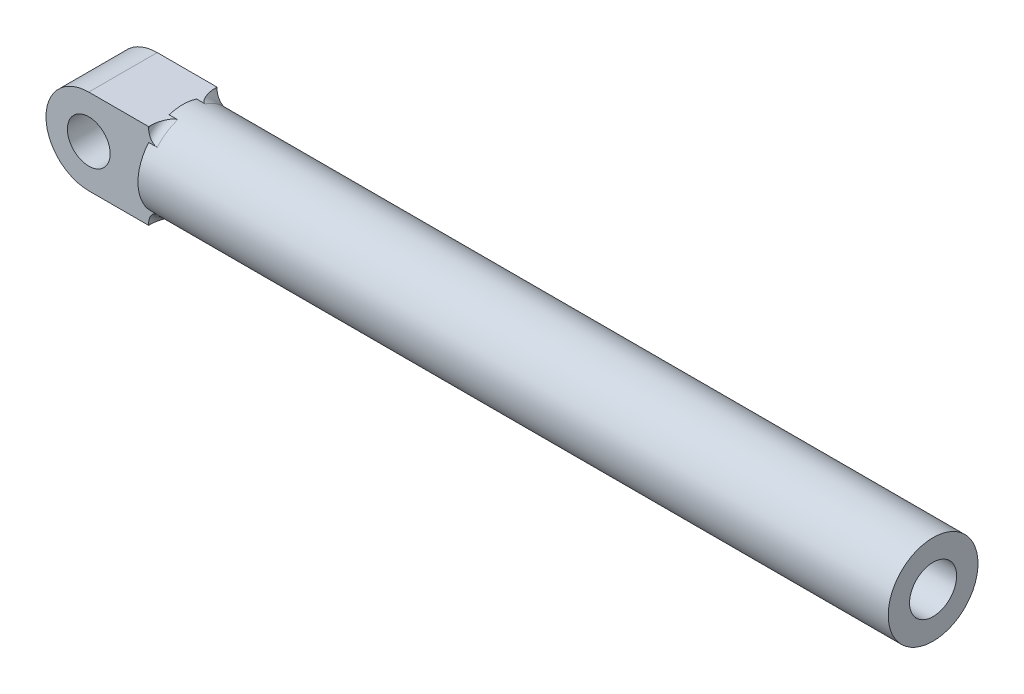
ISO-10303-21;
HEADER;
FILE_DESCRIPTION(('STEP AP214'),'2;1');
FILE_NAME('part.step','',(''),(''),'','','');
FILE_SCHEMA(('AUTOMOTIVE_DESIGN { 1 0 10303 214 1 1 1 1 }'));
ENDSEC;
DATA;
#1=APPLICATION_CONTEXT('core data for automotive mechanical design processes');
#2=APPLICATION_PROTOCOL_DEFINITION('international standard','automotive_design',2000,#1);
#3=PRODUCT_CONTEXT('',#1,'mechanical');
#4=PRODUCT('Part','Part','',(#3));
#5=PRODUCT_RELATED_PRODUCT_CATEGORY('part','',(#4));
#6=PRODUCT_DEFINITION_FORMATION('','',#4);
#7=PRODUCT_DEFINITION_CONTEXT('part definition',#1,'design');
#8=PRODUCT_DEFINITION('design','',#6,#7);
#9=PRODUCT_DEFINITION_SHAPE('','',#8);
#10=(LENGTH_UNIT() NAMED_UNIT(*) SI_UNIT(.MILLI.,.METRE.));
#11=(NAMED_UNIT(*) PLANE_ANGLE_UNIT() SI_UNIT($,.RADIAN.));
#12=(NAMED_UNIT(*) SI_UNIT($,.STERADIAN.) SOLID_ANGLE_UNIT());
#13=UNCERTAINTY_MEASURE_WITH_UNIT(LENGTH_MEASURE(1.E-05),#10,'distance_accuracy_value','');
#14=(GEOMETRIC_REPRESENTATION_CONTEXT(3) GLOBAL_UNCERTAINTY_ASSIGNED_CONTEXT((#13)) GLOBAL_UNIT_ASSIGNED_CONTEXT((#10,
#11,#12)) REPRESENTATION_CONTEXT('',''));
#15=CARTESIAN_POINT('',(0.,0.,0.));
#16=DIRECTION('',(0.,0.,1.));
#17=DIRECTION('',(1.,0.,0.));
#18=AXIS2_PLACEMENT_3D('',#15,#16,#17);
#19=CARTESIAN_POINT('',(-87.,0.,-52.5));
#20=DIRECTION('',(0.,0.,1.));
#21=DIRECTION('',(1.,0.,0.));
#22=AXIS2_PLACEMENT_3D('',#19,#20,#21);
#23=CYLINDRICAL_SURFACE('',#22,25.);
#24=CARTESIAN_POINT('',(-87.,0.,-40.));
#25=DIRECTION('',(0.,0.,1.));
#26=DIRECTION('',(1.,0.,0.));
#27=AXIS2_PLACEMENT_3D('',#24,#25,#26);
#28=CIRCLE('',#27,25.);
#29=CARTESIAN_POINT('',(-112.,0.,-40.));
#30=VERTEX_POINT('',#29);
#31=EDGE_CURVE('E25',#30,#30,#28,.T.);
#32=ORIENTED_EDGE('',*,*,#31,.F.);
#33=DIRECTION('',(0.,0.,1.));
#34=VECTOR('',#33,1.);
#35=CARTESIAN_POINT('',(-112.,0.,-52.5));
#36=LINE('',#35,#34);
#37=CARTESIAN_POINT('',(-112.,0.,40.));
#38=VERTEX_POINT('',#37);
#39=EDGE_CURVE('E11',#30,#38,#36,.T.);
#40=ORIENTED_EDGE('',*,*,#39,.T.);
#41=CARTESIAN_POINT('',(-87.,0.,40.));
#42=DIRECTION('',(0.,0.,1.));
#43=DIRECTION('',(1.,0.,0.));
#44=AXIS2_PLACEMENT_3D('',#41,#42,#43);
#45=CIRCLE('',#44,25.);
#46=EDGE_CURVE('E303',#38,#38,#45,.T.);
#47=ORIENTED_EDGE('',*,*,#46,.T.);
#48=ORIENTED_EDGE('',*,*,#39,.F.);
#49=EDGE_LOOP('',(#32,#40,#47,#48));
#50=FACE_BOUND('',#49,.T.);
#51=ADVANCED_FACE('F16',(#50),#23,.F.);
#52=CARTESIAN_POINT('',(-6.99999999999991,0.,0.));
#53=DIRECTION('',(-1.,0.,0.));
#54=DIRECTION('',(0.,0.,1.));
#55=AXIS2_PLACEMENT_3D('',#52,#53,#54);
#56=TOROIDAL_SURFACE('',#55,62.5,10.);
#57=CARTESIAN_POINT('',(-6.99999999999999,50.,-16.0078105935821));
#58=CARTESIAN_POINT('',(-8.3757529835826,50.,-16.0078105935821));
#59=CARTESIAN_POINT('',(-9.79273473438209,50.,-17.2679061705847));
#60=CARTESIAN_POINT('',(-10.811375688457,50.,-18.1737646688041));
#61=CARTESIAN_POINT('',(-11.8159590088257,50.,-19.6829022776896));
#62=CARTESIAN_POINT('',(-13.3583163061764,50.,-21.9999120832245));
#63=CARTESIAN_POINT('',(-14.5900398892349,50.,-25.1904163602448));
#64=CARTESIAN_POINT('',(-15.7495333176843,50.,-28.1938245871611));
#65=CARTESIAN_POINT('',(-16.3681689028075,50.,-31.3302734693486));
#66=CARTESIAN_POINT('',(-17.,50.,-34.5336228824376));
#67=CARTESIAN_POINT('',(-17.,50.,-37.5));
#68=B_SPLINE_CURVE_WITH_KNOTS('',2,(#57,#58,#59,#60,#61,#62,#63,#64,#65,#66,#67),.UNSPECIFIED.,
.F.,.F.,(3,2,2,2,2,3),(0.,0.125,0.25,0.5,0.75,1.),.UNSPECIFIED.);
#69=CARTESIAN_POINT('',(-6.99999999999991,50.,-16.0078105935821));
#70=VERTEX_POINT('',#69);
#71=CARTESIAN_POINT('',(-17.,50.,-37.5));
#72=VERTEX_POINT('',#71);
#73=EDGE_CURVE('E423',#70,#72,#68,.T.);
#74=ORIENTED_EDGE('',*,*,#73,.F.);
#75=CARTESIAN_POINT('',(-6.99999999999991,0.,0.));
#76=DIRECTION('',(1.,0.,0.));
#77=DIRECTION('',(0.,0.,1.));
#78=AXIS2_PLACEMENT_3D('',#75,#76,#77);
#79=CIRCLE('',#78,52.5);
#80=CARTESIAN_POINT('',(-6.99999999999991,34.0036762718386,-40.));
#81=VERTEX_POINT('',#80);
#82=EDGE_CURVE('E206',#81,#70,#79,.T.);
#83=ORIENTED_EDGE('',*,*,#82,.F.);
#84=CARTESIAN_POINT('',(-17.,48.0234317807464,-40.));
#85=CARTESIAN_POINT('',(-17.,45.6565577303607,-40.));
#86=CARTESIAN_POINT('',(-16.3536993868603,43.3229169140239,-40.));
#87=CARTESIAN_POINT('',(-16.0450929589387,42.2086110604629,-40.));
#88=CARTESIAN_POINT('',(-15.5934174876705,41.1495749788464,-40.));
#89=CARTESIAN_POINT('',(-15.1082020351406,40.0118982523589,-40.));
#90=CARTESIAN_POINT('',(-14.4840350448594,39.0038193226509,-40.));
#91=CARTESIAN_POINT('',(-13.8505404749445,37.9806756159836,-40.));
#92=CARTESIAN_POINT('',(-13.1137885685689,37.144986664751,-40.));
#93=CARTESIAN_POINT('',(-12.2786054061227,36.1976483069239,-40.));
#94=CARTESIAN_POINT('',(-11.3488315247879,35.5219521323174,-40.));
#95=CARTESIAN_POINT('',(-10.3639886854479,34.8062355989865,-40.));
#96=CARTESIAN_POINT('',(-9.31588381237329,34.4225979387912,-40.));
#97=CARTESIAN_POINT('',(-8.17138240876739,34.0036762718386,-40.));
#98=CARTESIAN_POINT('',(-6.99999999999999,34.0036762718386,-40.));
#99=B_SPLINE_CURVE_WITH_KNOTS('',2,(#84,#85,#86,#87,#88,#89,#90,#91,#92,#93,#94,#95,#96,#97,
#98),.UNSPECIFIED.,.F.,.F.,(3,2,2,2,2,2,2,3),(0.,0.25,0.375,0.5,0.625,0.75,0.875,1.),.UNSPECIFIED.);
#100=CARTESIAN_POINT('',(-17.,48.0234317807464,-40.));
#101=VERTEX_POINT('',#100);
#102=EDGE_CURVE('E308',#101,#81,#99,.T.);
#103=ORIENTED_EDGE('',*,*,#102,.F.);
#104=CARTESIAN_POINT('',(-17.,0.,0.));
#105=DIRECTION('',(-1.,0.,0.));
#106=DIRECTION('',(0.,0.,1.));
#107=AXIS2_PLACEMENT_3D('',#104,#105,#106);
#108=CIRCLE('',#107,62.5);
#109=EDGE_CURVE('E386',#72,#101,#108,.T.);
#110=ORIENTED_EDGE('',*,*,#109,.F.);
#111=EDGE_LOOP('',(#74,#83,#103,#110));
#112=FACE_BOUND('',#111,.T.);
#113=ADVANCED_FACE('F357',(#112),#56,.F.);
#114=CARTESIAN_POINT('',(-6.99999999999991,0.,0.));
#115=DIRECTION('',(-1.,0.,0.));
#116=DIRECTION('',(0.,0.,1.));
#117=AXIS2_PLACEMENT_3D('',#114,#115,#116);
#118=TOROIDAL_SURFACE('',#117,62.5,10.);
#119=CARTESIAN_POINT('',(-6.99999999999999,34.0036762718386,40.));
#120=CARTESIAN_POINT('',(-8.17080767103919,34.0036762718386,40.));
#121=CARTESIAN_POINT('',(-9.31588381237329,34.4225979387912,40.));
#122=CARTESIAN_POINT('',(-10.362940285267,34.8056594900581,40.));
#123=CARTESIAN_POINT('',(-11.3488315247879,35.5219521323174,40.));
#124=CARTESIAN_POINT('',(-12.2777347853929,36.1968405421844,40.));
#125=CARTESIAN_POINT('',(-13.1137885685689,37.144986664751,40.));
#126=CARTESIAN_POINT('',(-13.8498348581443,37.9797169770035,40.));
#127=CARTESIAN_POINT('',(-14.4840350448594,39.0038193226509,40.));
#128=CARTESIAN_POINT('',(-15.1076556260574,40.0108377899692,40.));
#129=CARTESIAN_POINT('',(-15.5934174876705,41.1495749788464,40.));
#130=CARTESIAN_POINT('',(-16.0447055938528,42.2074977801572,40.));
#131=CARTESIAN_POINT('',(-16.3536993868603,43.3229169140239,40.));
#132=CARTESIAN_POINT('',(-17.,45.6559607694015,40.));
#133=CARTESIAN_POINT('',(-17.,48.0234317807464,40.));
#134=B_SPLINE_CURVE_WITH_KNOTS('',2,(#119,#120,#121,#122,#123,#124,#125,#126,#127,#128,#129,
#130,#131,#132,#133),.UNSPECIFIED.,.F.,.F.,(3,2,2,2,2,2,2,3),(0.,0.125,0.25,0.375,0.5,0.625,
0.75,1.),.UNSPECIFIED.);
#135=CARTESIAN_POINT('',(-6.99999999999991,34.0036762718386,40.));
#136=VERTEX_POINT('',#135);
#137=CARTESIAN_POINT('',(-17.,48.0234317807464,40.));
#138=VERTEX_POINT('',#137);
#139=EDGE_CURVE('E307',#136,#138,#134,.T.);
#140=ORIENTED_EDGE('',*,*,#139,.F.);
#141=CARTESIAN_POINT('',(-6.99999999999991,0.,0.));
#142=DIRECTION('',(1.,0.,0.));
#143=DIRECTION('',(0.,0.,1.));
#144=AXIS2_PLACEMENT_3D('',#141,#142,#143);
#145=CIRCLE('',#144,52.5);
#146=CARTESIAN_POINT('',(-6.99999999999991,50.,16.0078105935821));
#147=VERTEX_POINT('',#146);
#148=EDGE_CURVE('E518',#147,#136,#145,.T.);
#149=ORIENTED_EDGE('',*,*,#148,.F.);
#150=CARTESIAN_POINT('',(-17.,50.,37.5));
#151=CARTESIAN_POINT('',(-17.,50.,34.5342056868546));
#152=CARTESIAN_POINT('',(-16.3681689028075,50.,31.3302734693485));
#153=CARTESIAN_POINT('',(-15.7498859580405,50.,28.1950421471237));
#154=CARTESIAN_POINT('',(-14.5900398892349,50.,25.1904163602448));
#155=CARTESIAN_POINT('',(-13.3589171741833,50.,22.0011456837783));
#156=CARTESIAN_POINT('',(-11.8159590088257,50.,19.6829022776896));
#157=CARTESIAN_POINT('',(-10.8121554556432,50.,18.1747207725648));
#158=CARTESIAN_POINT('',(-9.79273473438209,50.,17.2679061705848));
#159=CARTESIAN_POINT('',(-8.37616343175739,50.,16.0078105935821));
#160=CARTESIAN_POINT('',(-6.99999999999999,50.,16.0078105935821));
#161=B_SPLINE_CURVE_WITH_KNOTS('',2,(#150,#151,#152,#153,#154,#155,#156,#157,#158,#159,#160),
.UNSPECIFIED.,.F.,.F.,(3,2,2,2,2,3),(0.,0.25,0.5,0.75,0.875,1.),.UNSPECIFIED.);
#162=CARTESIAN_POINT('',(-17.,50.,37.5));
#163=VERTEX_POINT('',#162);
#164=EDGE_CURVE('E305',#163,#147,#161,.T.);
#165=ORIENTED_EDGE('',*,*,#164,.F.);
#166=CARTESIAN_POINT('',(-17.,0.,0.));
#167=DIRECTION('',(-1.,0.,0.));
#168=DIRECTION('',(0.,0.,1.));
#169=AXIS2_PLACEMENT_3D('',#166,#167,#168);
#170=CIRCLE('',#169,62.5);
#171=EDGE_CURVE('E523',#138,#163,#170,.T.);
#172=ORIENTED_EDGE('',*,*,#171,.F.);
#173=EDGE_LOOP('',(#140,#149,#165,#172));
#174=FACE_BOUND('',#173,.T.);
#175=ADVANCED_FACE('F366',(#174),#118,.F.);
#176=CARTESIAN_POINT('',(-6.99999999999991,0.,0.));
#177=DIRECTION('',(-1.,0.,0.));
#178=DIRECTION('',(0.,0.,1.));
#179=AXIS2_PLACEMENT_3D('',#176,#177,#178);
#180=TOROIDAL_SURFACE('',#179,62.5,10.);
#181=CARTESIAN_POINT('',(-6.99999999999999,-50.,16.0078105935821));
#182=CARTESIAN_POINT('',(-8.375752983589,-50.,16.0078105935821));
#183=CARTESIAN_POINT('',(-9.79273473438209,-50.,17.2679061705848));
#184=CARTESIAN_POINT('',(-10.8113756884637,-50.,18.1737646688142));
#185=CARTESIAN_POINT('',(-11.8159590088257,-50.,19.6829022776896));
#186=CARTESIAN_POINT('',(-13.3583163061584,-50.,21.9999120831974));
#187=CARTESIAN_POINT('',(-14.5900398892349,-50.,25.1904163602448));
#188=CARTESIAN_POINT('',(-15.7495333176768,-50.,28.1938245871232));
#189=CARTESIAN_POINT('',(-16.3681689028075,-50.,31.3302734693485));
#190=CARTESIAN_POINT('',(-17.,-50.,34.5336228824376));
#191=CARTESIAN_POINT('',(-17.,-50.,37.5));
#192=B_SPLINE_CURVE_WITH_KNOTS('',2,(#181,#182,#183,#184,#185,#186,#187,#188,#189,#190,#191),
.UNSPECIFIED.,.F.,.F.,(3,2,2,2,2,3),(0.,0.125,0.25,0.5,0.75,1.),.UNSPECIFIED.);
#193=CARTESIAN_POINT('',(-6.99999999999991,-50.,16.0078105935821));
#194=VERTEX_POINT('',#193);
#195=CARTESIAN_POINT('',(-17.,-50.,37.5));
#196=VERTEX_POINT('',#195);
#197=EDGE_CURVE('E300',#194,#196,#192,.T.);
#198=ORIENTED_EDGE('',*,*,#197,.F.);
#199=CARTESIAN_POINT('',(-6.99999999999991,0.,0.));
#200=DIRECTION('',(1.,0.,0.));
#201=DIRECTION('',(0.,0.,1.));
#202=AXIS2_PLACEMENT_3D('',#199,#200,#201);
#203=CIRCLE('',#202,52.5);
#204=CARTESIAN_POINT('',(-6.99999999999991,-34.0036762718386,40.));
#205=VERTEX_POINT('',#204);
#206=EDGE_CURVE('E430',#205,#194,#203,.T.);
#207=ORIENTED_EDGE('',*,*,#206,.F.);
#208=CARTESIAN_POINT('',(-17.,-48.0234317807464,40.));
#209=CARTESIAN_POINT('',(-17.,-45.6565577304488,40.));
#210=CARTESIAN_POINT('',(-16.3536993868603,-43.3229169140239,40.));
#211=CARTESIAN_POINT('',(-16.0450929589911,-42.2086110606102,40.));
#212=CARTESIAN_POINT('',(-15.5934174876705,-41.1495749788463,40.));
#213=CARTESIAN_POINT('',(-15.1082020351466,-40.0118982523466,40.));
#214=CARTESIAN_POINT('',(-14.4840350448594,-39.0038193226509,40.));
#215=CARTESIAN_POINT('',(-13.8505404748983,-37.9806756159312,40.));
#216=CARTESIAN_POINT('',(-13.1137885685689,-37.1449866647509,40.));
#217=CARTESIAN_POINT('',(-12.2786054061065,-36.1976483069055,40.));
#218=CARTESIAN_POINT('',(-11.3488315247879,-35.5219521323174,40.));
#219=CARTESIAN_POINT('',(-10.3639886854285,-34.8062355989794,40.));
#220=CARTESIAN_POINT('',(-9.31588381237329,-34.4225979387912,40.));
#221=CARTESIAN_POINT('',(-8.17138240876739,-34.0036762718386,40.));
#222=CARTESIAN_POINT('',(-6.99999999999999,-34.0036762718386,40.));
#223=B_SPLINE_CURVE_WITH_KNOTS('',2,(#208,#209,#210,#211,#212,#213,#214,#215,#216,#217,#218,
#219,#220,#221,#222),.UNSPECIFIED.,.F.,.F.,(3,2,2,2,2,2,2,3),(0.,0.25,0.375,0.5,0.625,0.75,
0.875,1.),.UNSPECIFIED.);
#224=CARTESIAN_POINT('',(-17.,-48.0234317807464,40.));
#225=VERTEX_POINT('',#224);
#226=EDGE_CURVE('E551',#225,#205,#223,.T.);
#227=ORIENTED_EDGE('',*,*,#226,.F.);
#228=CARTESIAN_POINT('',(-17.,0.,0.));
#229=DIRECTION('',(-1.,0.,0.));
#230=DIRECTION('',(0.,0.,1.));
#231=AXIS2_PLACEMENT_3D('',#228,#229,#230);
#232=CIRCLE('',#231,62.5);
#233=EDGE_CURVE('E436',#196,#225,#232,.T.);
#234=ORIENTED_EDGE('',*,*,#233,.F.);
#235=EDGE_LOOP('',(#198,#207,#227,#234));
#236=FACE_BOUND('',#235,.T.);
#237=ADVANCED_FACE('F450',(#236),#180,.F.);
#238=CARTESIAN_POINT('',(-6.99999999999991,0.,0.));
#239=DIRECTION('',(-1.,0.,0.));
#240=DIRECTION('',(0.,0.,1.));
#241=AXIS2_PLACEMENT_3D('',#238,#239,#240);
#242=TOROIDAL_SURFACE('',#241,62.5,10.);
#243=CARTESIAN_POINT('',(-6.99999999999999,-34.0036762718386,-40.));
#244=CARTESIAN_POINT('',(-8.17080767109089,-34.0036762718386,-40.));
#245=CARTESIAN_POINT('',(-9.31588381237329,-34.4225979387912,-40.));
#246=CARTESIAN_POINT('',(-10.362940285315,-34.805659490093,-40.));
#247=CARTESIAN_POINT('',(-11.3488315247879,-35.5219521323174,-40.));
#248=CARTESIAN_POINT('',(-12.2777347853929,-36.1968405421844,-40.));
#249=CARTESIAN_POINT('',(-13.1137885685689,-37.1449866647509,-40.));
#250=CARTESIAN_POINT('',(-13.8498348581585,-37.9797169770196,-40.));
#251=CARTESIAN_POINT('',(-14.4840350448594,-39.0038193226509,-40.));
#252=CARTESIAN_POINT('',(-15.1076556260116,-40.010837789902,-40.));
#253=CARTESIAN_POINT('',(-15.5934174876705,-41.1495749788463,-40.));
#254=CARTESIAN_POINT('',(-16.0447055937903,-42.2074977799733,-40.));
#255=CARTESIAN_POINT('',(-16.3536993868603,-43.3229169140239,-40.));
#256=CARTESIAN_POINT('',(-17.,-45.6559607693141,-40.));
#257=CARTESIAN_POINT('',(-17.,-48.0234317807464,-40.));
#258=B_SPLINE_CURVE_WITH_KNOTS('',2,(#243,#244,#245,#246,#247,#248,#249,#250,#251,#252,#253,
#254,#255,#256,#257),.UNSPECIFIED.,.F.,.F.,(3,2,2,2,2,2,2,3),(0.,0.125,0.25,0.375,0.5,0.625,
0.75,1.),.UNSPECIFIED.);
#259=CARTESIAN_POINT('',(-6.99999999999991,-34.0036762718386,-40.));
#260=VERTEX_POINT('',#259);
#261=CARTESIAN_POINT('',(-17.,-48.0234317807464,-40.));
#262=VERTEX_POINT('',#261);
#263=EDGE_CURVE('E310',#260,#262,#258,.T.);
#264=ORIENTED_EDGE('',*,*,#263,.F.);
#265=CARTESIAN_POINT('',(-6.99999999999991,0.,0.));
#266=DIRECTION('',(1.,0.,0.));
#267=DIRECTION('',(0.,0.,1.));
#268=AXIS2_PLACEMENT_3D('',#265,#266,#267);
#269=CIRCLE('',#268,52.5);
#270=CARTESIAN_POINT('',(-6.99999999999991,-50.,-16.0078105935821));
#271=VERTEX_POINT('',#270);
#272=EDGE_CURVE('E592',#271,#260,#269,.T.);
#273=ORIENTED_EDGE('',*,*,#272,.F.);
#274=CARTESIAN_POINT('',(-17.,-50.,-37.5));
#275=CARTESIAN_POINT('',(-17.,-50.,-34.5342056868546));
#276=CARTESIAN_POINT('',(-16.3681689028075,-50.,-31.3302734693486));
#277=CARTESIAN_POINT('',(-15.7498859580405,-50.,-28.1950421471237));
#278=CARTESIAN_POINT('',(-14.5900398892349,-50.,-25.1904163602448));
#279=CARTESIAN_POINT('',(-13.3589171741761,-50.,-22.0011456837598));
#280=CARTESIAN_POINT('',(-11.8159590088257,-50.,-19.6829022776896));
#281=CARTESIAN_POINT('',(-10.8121554556216,-50.,-18.1747207725374));
#282=CARTESIAN_POINT('',(-9.79273473438209,-50.,-17.2679061705847));
#283=CARTESIAN_POINT('',(-8.37616343174459,-50.,-16.0078105935821));
#284=CARTESIAN_POINT('',(-6.99999999999999,-50.,-16.0078105935821));
#285=B_SPLINE_CURVE_WITH_KNOTS('',2,(#274,#275,#276,#277,#278,#279,#280,#281,#282,#283,#284),
.UNSPECIFIED.,.F.,.F.,(3,2,2,2,2,3),(0.,0.25,0.5,0.75,0.875,1.),.UNSPECIFIED.);
#286=CARTESIAN_POINT('',(-17.,-50.,-37.5));
#287=VERTEX_POINT('',#286);
#288=EDGE_CURVE('E291',#287,#271,#285,.T.);
#289=ORIENTED_EDGE('',*,*,#288,.F.);
#290=CARTESIAN_POINT('',(-17.,0.,0.));
#291=DIRECTION('',(-1.,0.,0.));
#292=DIRECTION('',(0.,0.,1.));
#293=AXIS2_PLACEMENT_3D('',#290,#291,#292);
#294=CIRCLE('',#293,62.5);
#295=EDGE_CURVE('E711',#262,#287,#294,.T.);
#296=ORIENTED_EDGE('',*,*,#295,.F.);
#297=EDGE_LOOP('',(#264,#273,#289,#296));
#298=FACE_BOUND('',#297,.T.);
#299=ADVANCED_FACE('F335',(#298),#242,.F.);
#300=CARTESIAN_POINT('',(-87.,0.,-40.));
#301=DIRECTION('',(0.,0.,1.));
#302=DIRECTION('',(1.,0.,0.));
#303=AXIS2_PLACEMENT_3D('',#300,#301,#302);
#304=PLANE('',#303);
#305=ORIENTED_EDGE('',*,*,#31,.T.);
#306=EDGE_LOOP('',(#305));
#307=FACE_BOUND('',#306,.T.);
#308=CARTESIAN_POINT('',(-87.,0.,-40.));
#309=DIRECTION('',(0.,0.,1.));
#310=DIRECTION('',(1.,0.,0.));
#311=AXIS2_PLACEMENT_3D('',#308,#309,#310);
#312=CIRCLE('',#311,50.);
#313=CARTESIAN_POINT('',(-87.,50.,-40.));
#314=VERTEX_POINT('',#313);
#315=CARTESIAN_POINT('',(-87.,-50.,-40.));
#316=VERTEX_POINT('',#315);
#317=EDGE_CURVE('E242',#314,#316,#312,.T.);
#318=ORIENTED_EDGE('',*,*,#317,.F.);
#319=DIRECTION('',(-1.,0.,0.));
#320=VECTOR('',#319,1.);
#321=CARTESIAN_POINT('',(-17.,50.,-40.));
#322=LINE('',#321,#320);
#323=CARTESIAN_POINT('',(-17.,50.,-40.));
#324=VERTEX_POINT('',#323);
#325=EDGE_CURVE('E296',#324,#314,#322,.T.);
#326=ORIENTED_EDGE('',*,*,#325,.F.);
#327=DIRECTION('',(0.,1.,0.));
#328=VECTOR('',#327,1.);
#329=CARTESIAN_POINT('',(-17.,48.0234317807464,-40.));
#330=LINE('',#329,#328);
#331=EDGE_CURVE('E360',#101,#324,#330,.T.);
#332=ORIENTED_EDGE('',*,*,#331,.F.);
#333=ORIENTED_EDGE('',*,*,#102,.T.);
#334=DIRECTION('',(1.,0.,0.));
#335=VECTOR('',#334,1.);
#336=CARTESIAN_POINT('',(-6.99999999999991,34.0036762718386,-40.));
#337=LINE('',#336,#335);
#338=CARTESIAN_POINT('',(-17.,34.0036762718386,-40.));
#339=VERTEX_POINT('',#338);
#340=EDGE_CURVE('E277',#339,#81,#337,.T.);
#341=ORIENTED_EDGE('',*,*,#340,.F.);
#342=DIRECTION('',(0.,1.,0.));
#343=VECTOR('',#342,1.);
#344=CARTESIAN_POINT('',(-17.,-34.0036762718386,-40.));
#345=LINE('',#344,#343);
#346=CARTESIAN_POINT('',(-17.,-34.0036762718386,-40.));
#347=VERTEX_POINT('',#346);
#348=EDGE_CURVE('E219',#347,#339,#345,.T.);
#349=ORIENTED_EDGE('',*,*,#348,.F.);
#350=DIRECTION('',(-1.,0.,0.));
#351=VECTOR('',#350,1.);
#352=CARTESIAN_POINT('',(-6.99999999999991,-34.0036762718386,-40.));
#353=LINE('',#352,#351);
#354=EDGE_CURVE('E272',#260,#347,#353,.T.);
#355=ORIENTED_EDGE('',*,*,#354,.F.);
#356=ORIENTED_EDGE('',*,*,#263,.T.);
#357=DIRECTION('',(0.,1.,0.));
#358=VECTOR('',#357,1.);
#359=CARTESIAN_POINT('',(-17.,-50.,-40.));
#360=LINE('',#359,#358);
#361=CARTESIAN_POINT('',(-17.,-50.,-40.));
#362=VERTEX_POINT('',#361);
#363=EDGE_CURVE('E720',#362,#262,#360,.T.);
#364=ORIENTED_EDGE('',*,*,#363,.F.);
#365=DIRECTION('',(1.,0.,0.));
#366=VECTOR('',#365,1.);
#367=CARTESIAN_POINT('',(-87.,-50.,-40.));
#368=LINE('',#367,#366);
#369=EDGE_CURVE('E261',#316,#362,#368,.T.);
#370=ORIENTED_EDGE('',*,*,#369,.F.);
#371=EDGE_LOOP('',(#318,#326,#332,#333,#341,#349,#355,#356,#364,#370));
#372=FACE_BOUND('',#371,.T.);
#373=ADVANCED_FACE('F321',(#307,#372),#304,.F.);
#374=CARTESIAN_POINT('',(-87.,0.,40.));
#375=DIRECTION('',(0.,0.,1.));
#376=DIRECTION('',(1.,0.,0.));
#377=AXIS2_PLACEMENT_3D('',#374,#375,#376);
#378=PLANE('',#377);
#379=ORIENTED_EDGE('',*,*,#46,.F.);
#380=EDGE_LOOP('',(#379));
#381=FACE_BOUND('',#380,.T.);
#382=CARTESIAN_POINT('',(-87.,0.,40.));
#383=DIRECTION('',(0.,0.,1.));
#384=DIRECTION('',(1.,0.,0.));
#385=AXIS2_PLACEMENT_3D('',#382,#383,#384);
#386=CIRCLE('',#385,50.);
#387=CARTESIAN_POINT('',(-87.,50.,40.));
#388=VERTEX_POINT('',#387);
#389=CARTESIAN_POINT('',(-87.,-50.,40.));
#390=VERTEX_POINT('',#389);
#391=EDGE_CURVE('E245',#388,#390,#386,.T.);
#392=ORIENTED_EDGE('',*,*,#391,.T.);
#393=DIRECTION('',(1.,0.,0.));
#394=VECTOR('',#393,1.);
#395=CARTESIAN_POINT('',(-87.,-50.,40.));
#396=LINE('',#395,#394);
#397=CARTESIAN_POINT('',(-17.,-50.,40.));
#398=VERTEX_POINT('',#397);
#399=EDGE_CURVE('E293',#390,#398,#396,.T.);
#400=ORIENTED_EDGE('',*,*,#399,.T.);
#401=DIRECTION('',(0.,1.,0.));
#402=VECTOR('',#401,1.);
#403=CARTESIAN_POINT('',(-17.,-50.,40.));
#404=LINE('',#403,#402);
#405=EDGE_CURVE('E287',#398,#225,#404,.T.);
#406=ORIENTED_EDGE('',*,*,#405,.T.);
#407=ORIENTED_EDGE('',*,*,#226,.T.);
#408=DIRECTION('',(1.,0.,0.));
#409=VECTOR('',#408,1.);
#410=CARTESIAN_POINT('',(-6.99999999999991,-34.0036762718386,40.));
#411=LINE('',#410,#409);
#412=CARTESIAN_POINT('',(-17.,-34.0036762718386,40.));
#413=VERTEX_POINT('',#412);
#414=EDGE_CURVE('E281',#413,#205,#411,.T.);
#415=ORIENTED_EDGE('',*,*,#414,.F.);
#416=DIRECTION('',(0.,1.,0.));
#417=VECTOR('',#416,1.);
#418=CARTESIAN_POINT('',(-17.,-34.0036762718386,40.));
#419=LINE('',#418,#417);
#420=CARTESIAN_POINT('',(-17.,34.0036762718386,40.));
#421=VERTEX_POINT('',#420);
#422=EDGE_CURVE('E475',#413,#421,#419,.T.);
#423=ORIENTED_EDGE('',*,*,#422,.T.);
#424=DIRECTION('',(-1.,0.,0.));
#425=VECTOR('',#424,1.);
#426=CARTESIAN_POINT('',(-6.99999999999991,34.0036762718386,40.));
#427=LINE('',#426,#425);
#428=EDGE_CURVE('E282',#136,#421,#427,.T.);
#429=ORIENTED_EDGE('',*,*,#428,.F.);
#430=ORIENTED_EDGE('',*,*,#139,.T.);
#431=DIRECTION('',(0.,1.,0.));
#432=VECTOR('',#431,1.);
#433=CARTESIAN_POINT('',(-17.,48.0234317807464,40.));
#434=LINE('',#433,#432);
#435=CARTESIAN_POINT('',(-17.,50.,40.));
#436=VERTEX_POINT('',#435);
#437=EDGE_CURVE('E532',#138,#436,#434,.T.);
#438=ORIENTED_EDGE('',*,*,#437,.T.);
#439=DIRECTION('',(-1.,0.,0.));
#440=VECTOR('',#439,1.);
#441=CARTESIAN_POINT('',(-17.,50.,40.));
#442=LINE('',#441,#440);
#443=EDGE_CURVE('E299',#436,#388,#442,.T.);
#444=ORIENTED_EDGE('',*,*,#443,.T.);
#445=EDGE_LOOP('',(#392,#400,#406,#407,#415,#423,#429,#430,#438,#444));
#446=FACE_BOUND('',#445,.T.);
#447=ADVANCED_FACE('F332',(#381,#446),#378,.T.);
#448=CARTESIAN_POINT('',(-87.,50.,40.));
#449=DIRECTION('',(0.,-1.,0.));
#450=DIRECTION('',(0.,0.,-1.));
#451=AXIS2_PLACEMENT_3D('',#448,#449,#450);
#452=PLANE('',#451);
#453=ORIENTED_EDGE('',*,*,#325,.T.);
#454=DIRECTION('',(0.,0.,-1.));
#455=VECTOR('',#454,1.);
#456=CARTESIAN_POINT('',(-87.,50.,40.));
#457=LINE('',#456,#455);
#458=EDGE_CURVE('E260',#388,#314,#457,.T.);
#459=ORIENTED_EDGE('',*,*,#458,.F.);
#460=ORIENTED_EDGE('',*,*,#443,.F.);
#461=DIRECTION('',(0.,0.,-1.));
#462=VECTOR('',#461,1.);
#463=CARTESIAN_POINT('',(-17.,50.,40.));
#464=LINE('',#463,#462);
#465=EDGE_CURVE('E388',#436,#163,#464,.T.);
#466=ORIENTED_EDGE('',*,*,#465,.T.);
#467=ORIENTED_EDGE('',*,*,#164,.T.);
#468=DIRECTION('',(1.,0.,0.));
#469=VECTOR('',#468,1.);
#470=CARTESIAN_POINT('',(-6.99999999999991,50.,16.0078105935821));
#471=LINE('',#470,#469);
#472=CARTESIAN_POINT('',(-17.,50.,16.0078105935821));
#473=VERTEX_POINT('',#472);
#474=EDGE_CURVE('E209',#473,#147,#471,.T.);
#475=ORIENTED_EDGE('',*,*,#474,.F.);
#476=DIRECTION('',(0.,0.,-1.));
#477=VECTOR('',#476,1.);
#478=CARTESIAN_POINT('',(-17.,50.,16.0078105935821));
#479=LINE('',#478,#477);
#480=CARTESIAN_POINT('',(-17.,50.,-16.0078105935821));
#481=VERTEX_POINT('',#480);
#482=EDGE_CURVE('E212',#473,#481,#479,.T.);
#483=ORIENTED_EDGE('',*,*,#482,.T.);
#484=DIRECTION('',(-1.,0.,0.));
#485=VECTOR('',#484,1.);
#486=CARTESIAN_POINT('',(-6.99999999999991,50.,-16.0078105935821));
#487=LINE('',#486,#485);
#488=EDGE_CURVE('E197',#70,#481,#487,.T.);
#489=ORIENTED_EDGE('',*,*,#488,.F.);
#490=ORIENTED_EDGE('',*,*,#73,.T.);
#491=DIRECTION('',(0.,0.,-1.));
#492=VECTOR('',#491,1.);
#493=CARTESIAN_POINT('',(-17.,50.,-37.5));
#494=LINE('',#493,#492);
#495=EDGE_CURVE('E384',#72,#324,#494,.T.);
#496=ORIENTED_EDGE('',*,*,#495,.T.);
#497=EDGE_LOOP('',(#453,#459,#460,#466,#467,#475,#483,#489,#490,#496));
#498=FACE_BOUND('',#497,.T.);
#499=ADVANCED_FACE('F217',(#498),#452,.F.);
#500=CARTESIAN_POINT('',(-87.,-50.,40.));
#501=DIRECTION('',(0.,1.,0.));
#502=DIRECTION('',(1.,0.,0.));
#503=AXIS2_PLACEMENT_3D('',#500,#501,#502);
#504=PLANE('',#503);
#505=ORIENTED_EDGE('',*,*,#369,.T.);
#506=DIRECTION('',(0.,0.,-1.));
#507=VECTOR('',#506,1.);
#508=CARTESIAN_POINT('',(-17.,-50.,-37.5));
#509=LINE('',#508,#507);
#510=EDGE_CURVE('E477',#287,#362,#509,.T.);
#511=ORIENTED_EDGE('',*,*,#510,.F.);
#512=ORIENTED_EDGE('',*,*,#288,.T.);
#513=DIRECTION('',(1.,0.,0.));
#514=VECTOR('',#513,1.);
#515=CARTESIAN_POINT('',(-6.99999999999991,-50.,-16.0078105935821));
#516=LINE('',#515,#514);
#517=CARTESIAN_POINT('',(-17.,-50.,-16.0078105935821));
#518=VERTEX_POINT('',#517);
#519=EDGE_CURVE('E768',#518,#271,#516,.T.);
#520=ORIENTED_EDGE('',*,*,#519,.F.);
#521=DIRECTION('',(0.,0.,-1.));
#522=VECTOR('',#521,1.);
#523=CARTESIAN_POINT('',(-17.,-50.,16.0078105935821));
#524=LINE('',#523,#522);
#525=CARTESIAN_POINT('',(-17.,-50.,16.0078105935821));
#526=VERTEX_POINT('',#525);
#527=EDGE_CURVE('E236',#526,#518,#524,.T.);
#528=ORIENTED_EDGE('',*,*,#527,.F.);
#529=DIRECTION('',(-1.,0.,0.));
#530=VECTOR('',#529,1.);
#531=CARTESIAN_POINT('',(-6.99999999999991,-50.,16.0078105935821));
#532=LINE('',#531,#530);
#533=EDGE_CURVE('E433',#194,#526,#532,.T.);
#534=ORIENTED_EDGE('',*,*,#533,.F.);
#535=ORIENTED_EDGE('',*,*,#197,.T.);
#536=DIRECTION('',(0.,0.,-1.));
#537=VECTOR('',#536,1.);
#538=CARTESIAN_POINT('',(-17.,-50.,40.));
#539=LINE('',#538,#537);
#540=EDGE_CURVE('E439',#398,#196,#539,.T.);
#541=ORIENTED_EDGE('',*,*,#540,.F.);
#542=ORIENTED_EDGE('',*,*,#399,.F.);
#543=DIRECTION('',(0.,0.,-1.));
#544=VECTOR('',#543,1.);
#545=CARTESIAN_POINT('',(-87.,-50.,40.));
#546=LINE('',#545,#544);
#547=EDGE_CURVE('E238',#390,#316,#546,.T.);
#548=ORIENTED_EDGE('',*,*,#547,.T.);
#549=EDGE_LOOP('',(#505,#511,#512,#520,#528,#534,#535,#541,#542,#548));
#550=FACE_BOUND('',#549,.T.);
#551=ADVANCED_FACE('F407',(#550),#504,.F.);
#552=CARTESIAN_POINT('',(-87.,0.,40.));
#553=DIRECTION('',(0.,0.,-1.));
#554=DIRECTION('',(-1.,0.,0.));
#555=AXIS2_PLACEMENT_3D('',#552,#553,#554);
#556=CYLINDRICAL_SURFACE('',#555,50.);
#557=ORIENTED_EDGE('',*,*,#317,.T.);
#558=ORIENTED_EDGE('',*,*,#547,.F.);
#559=ORIENTED_EDGE('',*,*,#391,.F.);
#560=ORIENTED_EDGE('',*,*,#458,.T.);
#561=EDGE_LOOP('',(#557,#558,#559,#560));
#562=FACE_BOUND('',#561,.T.);
#563=ADVANCED_FACE('F498',(#562),#556,.T.);
#564=CARTESIAN_POINT('',(-17.,-50.,40.));
#565=DIRECTION('',(-1.,0.,0.));
#566=DIRECTION('',(0.,0.,1.));
#567=AXIS2_PLACEMENT_3D('',#564,#565,#566);
#568=PLANE('',#567);
#569=ORIENTED_EDGE('',*,*,#540,.T.);
#570=ORIENTED_EDGE('',*,*,#233,.T.);
#571=ORIENTED_EDGE('',*,*,#405,.F.);
#572=EDGE_LOOP('',(#569,#570,#571));
#573=FACE_BOUND('',#572,.T.);
#574=ADVANCED_FACE('F1009',(#573),#568,.F.);
#575=CARTESIAN_POINT('',(-17.,-50.,40.));
#576=DIRECTION('',(-1.,0.,0.));
#577=DIRECTION('',(0.,0.,1.));
#578=AXIS2_PLACEMENT_3D('',#575,#576,#577);
#579=PLANE('',#578);
#580=ORIENTED_EDGE('',*,*,#363,.T.);
#581=ORIENTED_EDGE('',*,*,#295,.T.);
#582=ORIENTED_EDGE('',*,*,#510,.T.);
#583=EDGE_LOOP('',(#580,#581,#582));
#584=FACE_BOUND('',#583,.T.);
#585=ADVANCED_FACE('F331',(#584),#579,.F.);
#586=CARTESIAN_POINT('',(-17.,-50.,40.));
#587=DIRECTION('',(-1.,0.,0.));
#588=DIRECTION('',(0.,0.,1.));
#589=AXIS2_PLACEMENT_3D('',#586,#587,#588);
#590=PLANE('',#589);
#591=ORIENTED_EDGE('',*,*,#495,.F.);
#592=ORIENTED_EDGE('',*,*,#109,.T.);
#593=ORIENTED_EDGE('',*,*,#331,.T.);
#594=EDGE_LOOP('',(#591,#592,#593));
#595=FACE_BOUND('',#594,.T.);
#596=ADVANCED_FACE('F336',(#595),#590,.F.);
#597=CARTESIAN_POINT('',(-17.,-50.,40.));
#598=DIRECTION('',(-1.,0.,0.));
#599=DIRECTION('',(0.,0.,1.));
#600=AXIS2_PLACEMENT_3D('',#597,#598,#599);
#601=PLANE('',#600);
#602=ORIENTED_EDGE('',*,*,#437,.F.);
#603=ORIENTED_EDGE('',*,*,#171,.T.);
#604=ORIENTED_EDGE('',*,*,#465,.F.);
#605=EDGE_LOOP('',(#602,#603,#604));
#606=FACE_BOUND('',#605,.T.);
#607=ADVANCED_FACE('F977',(#606),#601,.F.);
#608=CARTESIAN_POINT('',(-17.,0.,0.));
#609=DIRECTION('',(-1.,0.,0.));
#610=DIRECTION('',(0.,0.,1.));
#611=AXIS2_PLACEMENT_3D('',#608,#609,#610);
#612=PLANE('',#611);
#613=ORIENTED_EDGE('',*,*,#422,.F.);
#614=CARTESIAN_POINT('',(-17.,0.,0.));
#615=DIRECTION('',(-1.,0.,0.));
#616=DIRECTION('',(0.,0.,1.));
#617=AXIS2_PLACEMENT_3D('',#614,#615,#616);
#618=CIRCLE('',#617,52.5);
#619=EDGE_CURVE('E280',#413,#421,#618,.T.);
#620=ORIENTED_EDGE('',*,*,#619,.T.);
#621=EDGE_LOOP('',(#613,#620));
#622=FACE_BOUND('',#621,.T.);
#623=ADVANCED_FACE('F569',(#622),#612,.T.);
#624=CARTESIAN_POINT('',(860.,52.5,0.));
#625=DIRECTION('',(-1.,0.,0.));
#626=DIRECTION('',(0.,0.,1.));
#627=AXIS2_PLACEMENT_3D('',#624,#625,#626);
#628=PLANE('',#627);
#629=CARTESIAN_POINT('',(860.,0.,0.));
#630=DIRECTION('',(1.,0.,0.));
#631=DIRECTION('',(0.,0.,-1.));
#632=AXIS2_PLACEMENT_3D('',#629,#630,#631);
#633=CIRCLE('',#632,27.5);
#634=CARTESIAN_POINT('',(860.,0.,27.5));
#635=VERTEX_POINT('',#634);
#636=EDGE_CURVE('E235',#635,#635,#633,.T.);
#637=ORIENTED_EDGE('',*,*,#636,.F.);
#638=EDGE_LOOP('',(#637));
#639=FACE_BOUND('',#638,.T.);
#640=CARTESIAN_POINT('',(860.,0.,0.));
#641=DIRECTION('',(-1.,0.,0.));
#642=DIRECTION('',(0.,0.,1.));
#643=AXIS2_PLACEMENT_3D('',#640,#641,#642);
#644=CIRCLE('',#643,52.5);
#645=CARTESIAN_POINT('',(860.,0.,-52.5));
#646=VERTEX_POINT('',#645);
#647=EDGE_CURVE('E275',#646,#646,#644,.T.);
#648=ORIENTED_EDGE('',*,*,#647,.F.);
#649=EDGE_LOOP('',(#648));
#650=FACE_BOUND('',#649,.T.);
#651=ADVANCED_FACE('F957',(#639,#650),#628,.F.);
#652=CARTESIAN_POINT('',(-40.,0.,0.));
#653=DIRECTION('',(-1.,0.,0.));
#654=DIRECTION('',(0.,0.,1.));
#655=AXIS2_PLACEMENT_3D('',#652,#653,#654);
#656=CYLINDRICAL_SURFACE('',#655,52.5);
#657=CARTESIAN_POINT('',(-17.,0.,0.));
#658=DIRECTION('',(-1.,0.,0.));
#659=DIRECTION('',(0.,0.,1.));
#660=AXIS2_PLACEMENT_3D('',#657,#658,#659);
#661=CIRCLE('',#660,52.5);
#662=EDGE_CURVE('E216',#518,#526,#661,.T.);
#663=ORIENTED_EDGE('',*,*,#662,.F.);
#664=ORIENTED_EDGE('',*,*,#519,.T.);
#665=ORIENTED_EDGE('',*,*,#272,.T.);
#666=ORIENTED_EDGE('',*,*,#354,.T.);
#667=CARTESIAN_POINT('',(-17.,0.,0.));
#668=DIRECTION('',(-1.,0.,0.));
#669=DIRECTION('',(0.,0.,1.));
#670=AXIS2_PLACEMENT_3D('',#667,#668,#669);
#671=CIRCLE('',#670,52.5);
#672=CARTESIAN_POINT('',(-17.,0.,-52.5));
#673=VERTEX_POINT('',#672);
#674=EDGE_CURVE('E229',#673,#347,#671,.T.);
#675=ORIENTED_EDGE('',*,*,#674,.F.);
#676=DIRECTION('',(1.,0.,0.));
#677=VECTOR('',#676,1.);
#678=CARTESIAN_POINT('',(-40.,0.,-52.5));
#679=LINE('',#678,#677);
#680=EDGE_CURVE('E268',#673,#646,#679,.T.);
#681=ORIENTED_EDGE('',*,*,#680,.T.);
#682=ORIENTED_EDGE('',*,*,#647,.T.);
#683=ORIENTED_EDGE('',*,*,#680,.F.);
#684=CARTESIAN_POINT('',(-17.,0.,0.));
#685=DIRECTION('',(-1.,0.,0.));
#686=DIRECTION('',(0.,0.,1.));
#687=AXIS2_PLACEMENT_3D('',#684,#685,#686);
#688=CIRCLE('',#687,52.5);
#689=EDGE_CURVE('E583',#339,#673,#688,.T.);
#690=ORIENTED_EDGE('',*,*,#689,.F.);
#691=ORIENTED_EDGE('',*,*,#340,.T.);
#692=ORIENTED_EDGE('',*,*,#82,.T.);
#693=ORIENTED_EDGE('',*,*,#488,.T.);
#694=CARTESIAN_POINT('',(-17.,0.,0.));
#695=DIRECTION('',(-1.,0.,0.));
#696=DIRECTION('',(0.,0.,1.));
#697=AXIS2_PLACEMENT_3D('',#694,#695,#696);
#698=CIRCLE('',#697,52.5);
#699=EDGE_CURVE('E205',#473,#481,#698,.T.);
#700=ORIENTED_EDGE('',*,*,#699,.F.);
#701=ORIENTED_EDGE('',*,*,#474,.T.);
#702=ORIENTED_EDGE('',*,*,#148,.T.);
#703=ORIENTED_EDGE('',*,*,#428,.T.);
#704=ORIENTED_EDGE('',*,*,#619,.F.);
#705=ORIENTED_EDGE('',*,*,#414,.T.);
#706=ORIENTED_EDGE('',*,*,#206,.T.);
#707=ORIENTED_EDGE('',*,*,#533,.T.);
#708=EDGE_LOOP('',(#663,#664,#665,#666,#675,#681,#682,#683,#690,#691,#692,#693,#700,#701,#702,
#703,#704,#705,#706,#707));
#709=FACE_BOUND('',#708,.T.);
#710=ADVANCED_FACE('F199',(#709),#656,.T.);
#711=CARTESIAN_POINT('',(-17.001,0.,0.));
#712=DIRECTION('',(1.,0.,0.));
#713=DIRECTION('',(0.,0.,-1.));
#714=AXIS2_PLACEMENT_3D('',#711,#712,#713);
#715=CYLINDRICAL_SURFACE('',#714,27.5);
#716=CARTESIAN_POINT('',(770.,0.,0.));
#717=DIRECTION('',(-1.,0.,0.));
#718=DIRECTION('',(0.,0.,-1.));
#719=AXIS2_PLACEMENT_3D('',#716,#717,#718);
#720=CIRCLE('',#719,27.5);
#721=CARTESIAN_POINT('',(770.,0.,27.5));
#722=VERTEX_POINT('',#721);
#723=EDGE_CURVE('E253',#722,#722,#720,.T.);
#724=ORIENTED_EDGE('',*,*,#723,.T.);
#725=DIRECTION('',(1.,0.,0.));
#726=VECTOR('',#725,1.);
#727=CARTESIAN_POINT('',(-17.001,0.,27.5));
#728=LINE('',#727,#726);
#729=EDGE_CURVE('E254',#722,#635,#728,.T.);
#730=ORIENTED_EDGE('',*,*,#729,.T.);
#731=ORIENTED_EDGE('',*,*,#636,.T.);
#732=ORIENTED_EDGE('',*,*,#729,.F.);
#733=EDGE_LOOP('',(#724,#730,#731,#732));
#734=FACE_BOUND('',#733,.T.);
#735=ADVANCED_FACE('F934',(#734),#715,.F.);
#736=CARTESIAN_POINT('',(0.,42.5,0.));
#737=DIRECTION('',(-1.,0.,0.));
#738=DIRECTION('',(0.,0.,1.));
#739=AXIS2_PLACEMENT_3D('',#736,#737,#738);
#740=PLANE('',#739);
#741=CARTESIAN_POINT('',(0.,0.,0.));
#742=DIRECTION('',(-1.,0.,0.));
#743=DIRECTION('',(0.,0.,1.));
#744=AXIS2_PLACEMENT_3D('',#741,#742,#743);
#745=CIRCLE('',#744,42.5);
#746=CARTESIAN_POINT('',(0.,0.,-42.5));
#747=VERTEX_POINT('',#746);
#748=EDGE_CURVE('E252',#747,#747,#745,.T.);
#749=ORIENTED_EDGE('',*,*,#748,.F.);
#750=EDGE_LOOP('',(#749));
#751=FACE_BOUND('',#750,.T.);
#752=ADVANCED_FACE('F923',(#751),#740,.F.);
#753=CARTESIAN_POINT('',(-40.,0.,0.));
#754=DIRECTION('',(-1.,0.,0.));
#755=DIRECTION('',(0.,0.,1.));
#756=AXIS2_PLACEMENT_3D('',#753,#754,#755);
#757=CYLINDRICAL_SURFACE('',#756,42.5);
#758=CARTESIAN_POINT('',(770.,0.,0.));
#759=DIRECTION('',(-1.,0.,0.));
#760=DIRECTION('',(0.,0.,1.));
#761=AXIS2_PLACEMENT_3D('',#758,#759,#760);
#762=CIRCLE('',#761,42.5);
#763=CARTESIAN_POINT('',(770.,0.,-42.5));
#764=VERTEX_POINT('',#763);
#765=EDGE_CURVE('E250',#764,#764,#762,.T.);
#766=ORIENTED_EDGE('',*,*,#765,.F.);
#767=DIRECTION('',(-1.,0.,0.));
#768=VECTOR('',#767,1.);
#769=CARTESIAN_POINT('',(-40.,0.,-42.5));
#770=LINE('',#769,#768);
#771=EDGE_CURVE('E258',#764,#747,#770,.T.);
#772=ORIENTED_EDGE('',*,*,#771,.T.);
#773=ORIENTED_EDGE('',*,*,#748,.T.);
#774=ORIENTED_EDGE('',*,*,#771,.F.);
#775=EDGE_LOOP('',(#766,#772,#773,#774));
#776=FACE_BOUND('',#775,.T.);
#777=ADVANCED_FACE('F909',(#776),#757,.F.);
#778=CARTESIAN_POINT('',(770.,42.5,0.));
#779=DIRECTION('',(1.,0.,0.));
#780=DIRECTION('',(0.,1.,0.));
#781=AXIS2_PLACEMENT_3D('',#778,#779,#780);
#782=PLANE('',#781);
#783=ORIENTED_EDGE('',*,*,#723,.F.);
#784=EDGE_LOOP('',(#783));
#785=FACE_BOUND('',#784,.T.);
#786=ORIENTED_EDGE('',*,*,#765,.T.);
#787=EDGE_LOOP('',(#786));
#788=FACE_BOUND('',#787,.T.);
#789=ADVANCED_FACE('F898',(#785,#788),#782,.F.);
#790=CARTESIAN_POINT('',(-17.,0.,0.));
#791=DIRECTION('',(-1.,0.,0.));
#792=DIRECTION('',(0.,0.,1.));
#793=AXIS2_PLACEMENT_3D('',#790,#791,#792);
#794=PLANE('',#793);
#795=ORIENTED_EDGE('',*,*,#662,.T.);
#796=ORIENTED_EDGE('',*,*,#527,.T.);
#797=EDGE_LOOP('',(#795,#796));
#798=FACE_BOUND('',#797,.T.);
#799=ADVANCED_FACE('F886',(#798),#794,.T.);
#800=CARTESIAN_POINT('',(-17.,0.,0.));
#801=DIRECTION('',(-1.,0.,0.));
#802=DIRECTION('',(0.,0.,1.));
#803=AXIS2_PLACEMENT_3D('',#800,#801,#802);
#804=PLANE('',#803);
#805=ORIENTED_EDGE('',*,*,#482,.F.);
#806=ORIENTED_EDGE('',*,*,#699,.T.);
#807=EDGE_LOOP('',(#805,#806));
#808=FACE_BOUND('',#807,.T.);
#809=ADVANCED_FACE('F213',(#808),#804,.T.);
#810=CARTESIAN_POINT('',(-17.,0.,0.));
#811=DIRECTION('',(-1.,0.,0.));
#812=DIRECTION('',(0.,0.,1.));
#813=AXIS2_PLACEMENT_3D('',#810,#811,#812);
#814=PLANE('',#813);
#815=ORIENTED_EDGE('',*,*,#689,.T.);
#816=ORIENTED_EDGE('',*,*,#674,.T.);
#817=ORIENTED_EDGE('',*,*,#348,.T.);
#818=EDGE_LOOP('',(#815,#816,#817));
#819=FACE_BOUND('',#818,.T.);
#820=ADVANCED_FACE('F586',(#819),#814,.T.);
#821=CLOSED_SHELL('',(#51,#113,#175,#237,#299,#373,#447,#499,#551,#563,#574,#585,#596,#607,#623,
#651,#710,#735,#752,#777,#789,#799,#809,#820));
#822=MANIFOLD_SOLID_BREP('B1',#821);
#823=ADVANCED_BREP_SHAPE_REPRESENTATION('',(#18,#822),#14);
#824=SHAPE_DEFINITION_REPRESENTATION(#9,#823);
ENDSEC;
END-ISO-10303-21;
